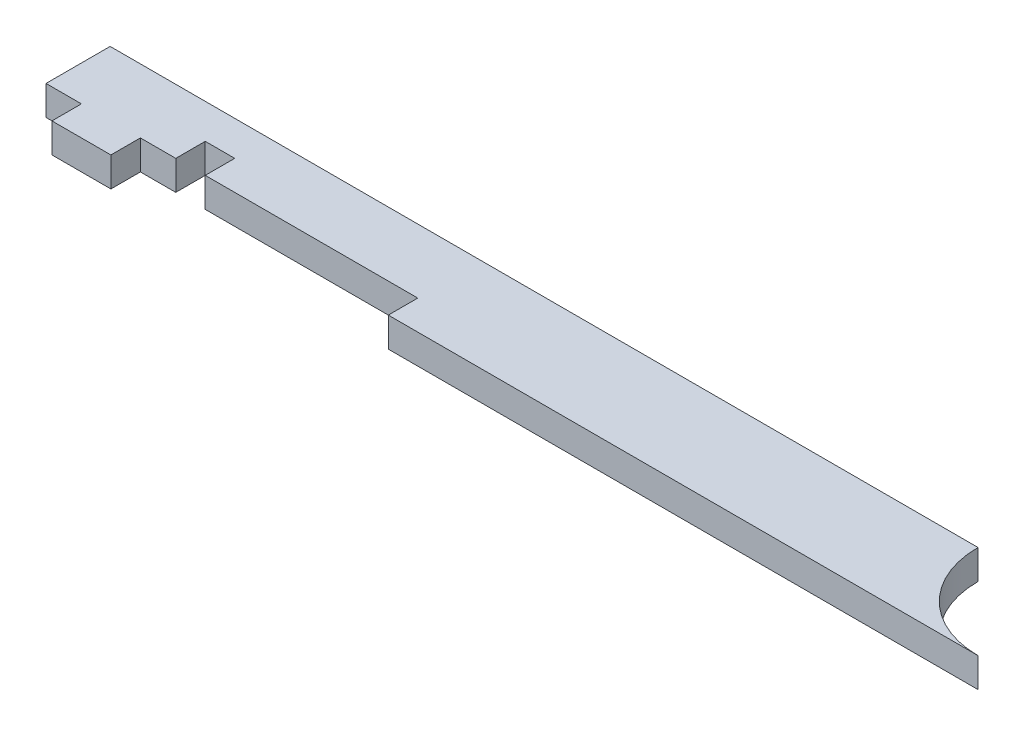
ISO-10303-21;
HEADER;
FILE_DESCRIPTION(('STEP AP214'),'2;1');
FILE_NAME('part.step','',(''),(''),'','','');
FILE_SCHEMA(('AUTOMOTIVE_DESIGN { 1 0 10303 214 1 1 1 1 }'));
ENDSEC;
DATA;
#1=APPLICATION_CONTEXT('core data for automotive mechanical design processes');
#2=APPLICATION_PROTOCOL_DEFINITION('international standard','automotive_design',2000,#1);
#3=PRODUCT_CONTEXT('',#1,'mechanical');
#4=PRODUCT('Part','Part','',(#3));
#5=PRODUCT_RELATED_PRODUCT_CATEGORY('part','',(#4));
#6=PRODUCT_DEFINITION_FORMATION('','',#4);
#7=PRODUCT_DEFINITION_CONTEXT('part definition',#1,'design');
#8=PRODUCT_DEFINITION('design','',#6,#7);
#9=PRODUCT_DEFINITION_SHAPE('','',#8);
#10=(LENGTH_UNIT() NAMED_UNIT(*) SI_UNIT(.MILLI.,.METRE.));
#11=(NAMED_UNIT(*) PLANE_ANGLE_UNIT() SI_UNIT($,.RADIAN.));
#12=(NAMED_UNIT(*) SI_UNIT($,.STERADIAN.) SOLID_ANGLE_UNIT());
#13=UNCERTAINTY_MEASURE_WITH_UNIT(LENGTH_MEASURE(1.E-05),#10,'distance_accuracy_value','');
#14=(GEOMETRIC_REPRESENTATION_CONTEXT(3) GLOBAL_UNCERTAINTY_ASSIGNED_CONTEXT((#13)) GLOBAL_UNIT_ASSIGNED_CONTEXT((#10,
#11,#12)) REPRESENTATION_CONTEXT('',''));
#15=CARTESIAN_POINT('',(0.,0.,0.));
#16=DIRECTION('',(0.,0.,1.));
#17=DIRECTION('',(1.,0.,0.));
#18=AXIS2_PLACEMENT_3D('',#15,#16,#17);
#19=CARTESIAN_POINT('',(0.,2.5,0.));
#20=DIRECTION('',(0.,-1.,0.));
#21=DIRECTION('',(0.,0.,-1.));
#22=AXIS2_PLACEMENT_3D('',#19,#20,#21);
#23=CYLINDRICAL_SURFACE('',#22,15.875);
#24=CARTESIAN_POINT('',(0.,-2.5,0.));
#25=DIRECTION('',(0.,1.,0.));
#26=DIRECTION('',(0.,0.,1.));
#27=AXIS2_PLACEMENT_3D('',#24,#25,#26);
#28=CIRCLE('',#27,15.875);
#29=CARTESIAN_POINT('',(-15.875,-2.5,0.));
#30=VERTEX_POINT('',#29);
#31=CARTESIAN_POINT('',(0.,-2.5,15.875));
#32=VERTEX_POINT('',#31);
#33=EDGE_CURVE('E173',#30,#32,#28,.T.);
#34=ORIENTED_EDGE('',*,*,#33,.F.);
#35=DIRECTION('',(0.,-1.,0.));
#36=VECTOR('',#35,1.);
#37=CARTESIAN_POINT('',(-15.875,2.5,0.));
#38=LINE('',#37,#36);
#39=CARTESIAN_POINT('',(-15.875,2.5,0.));
#40=VERTEX_POINT('',#39);
#41=EDGE_CURVE('E11',#40,#30,#38,.T.);
#42=ORIENTED_EDGE('',*,*,#41,.F.);
#43=CARTESIAN_POINT('',(0.,2.5,0.));
#44=DIRECTION('',(0.,1.,0.));
#45=DIRECTION('',(0.,0.,1.));
#46=AXIS2_PLACEMENT_3D('',#43,#44,#45);
#47=CIRCLE('',#46,15.875);
#48=CARTESIAN_POINT('',(0.,2.5,15.875));
#49=VERTEX_POINT('',#48);
#50=EDGE_CURVE('E206',#40,#49,#47,.T.);
#51=ORIENTED_EDGE('',*,*,#50,.T.);
#52=DIRECTION('',(0.,-1.,0.));
#53=VECTOR('',#52,1.);
#54=CARTESIAN_POINT('',(0.,2.5,15.875));
#55=LINE('',#54,#53);
#56=EDGE_CURVE('E57',#49,#32,#55,.T.);
#57=ORIENTED_EDGE('',*,*,#56,.T.);
#58=EDGE_LOOP('',(#34,#42,#51,#57));
#59=FACE_BOUND('',#58,.T.);
#60=ADVANCED_FACE('F41',(#59),#23,.F.);
#61=CARTESIAN_POINT('',(0.,2.5,0.));
#62=DIRECTION('',(0.,0.,1.));
#63=DIRECTION('',(1.,0.,0.));
#64=AXIS2_PLACEMENT_3D('',#61,#62,#63);
#65=PLANE('',#64);
#66=DIRECTION('',(-1.,0.,0.));
#67=VECTOR('',#66,1.);
#68=CARTESIAN_POINT('',(0.,-2.5,0.));
#69=LINE('',#68,#67);
#70=CARTESIAN_POINT('',(-163.044989152832,-2.5,0.));
#71=VERTEX_POINT('',#70);
#72=EDGE_CURVE('E175',#30,#71,#69,.T.);
#73=ORIENTED_EDGE('',*,*,#72,.T.);
#74=DIRECTION('',(0.,-1.,0.));
#75=VECTOR('',#74,1.);
#76=CARTESIAN_POINT('',(-163.044989152832,2.5,0.));
#77=LINE('',#76,#75);
#78=CARTESIAN_POINT('',(-163.044989152832,2.5,0.));
#79=VERTEX_POINT('',#78);
#80=EDGE_CURVE('E49',#79,#71,#77,.T.);
#81=ORIENTED_EDGE('',*,*,#80,.F.);
#82=DIRECTION('',(-1.,0.,0.));
#83=VECTOR('',#82,1.);
#84=CARTESIAN_POINT('',(0.,2.5,0.));
#85=LINE('',#84,#83);
#86=EDGE_CURVE('E246',#40,#79,#85,.T.);
#87=ORIENTED_EDGE('',*,*,#86,.F.);
#88=ORIENTED_EDGE('',*,*,#41,.T.);
#89=EDGE_LOOP('',(#73,#81,#87,#88));
#90=FACE_BOUND('',#89,.T.);
#91=ADVANCED_FACE('F236',(#90),#65,.F.);
#92=CARTESIAN_POINT('',(-163.044989152832,2.5,0.));
#93=DIRECTION('',(-1.,0.,0.));
#94=DIRECTION('',(0.,0.,1.));
#95=AXIS2_PLACEMENT_3D('',#92,#93,#94);
#96=PLANE('',#95);
#97=DIRECTION('',(0.,0.,-1.));
#98=VECTOR('',#97,1.);
#99=CARTESIAN_POINT('',(-163.044989152832,-2.5,0.));
#100=LINE('',#99,#98);
#101=CARTESIAN_POINT('',(-163.044989152832,-2.5,10.875));
#102=VERTEX_POINT('',#101);
#103=EDGE_CURVE('E178',#102,#71,#100,.T.);
#104=ORIENTED_EDGE('',*,*,#103,.F.);
#105=DIRECTION('',(0.,-1.,0.));
#106=VECTOR('',#105,1.);
#107=CARTESIAN_POINT('',(-163.044989152832,2.5,10.875));
#108=LINE('',#107,#106);
#109=CARTESIAN_POINT('',(-163.044989152832,2.5,10.875));
#110=VERTEX_POINT('',#109);
#111=EDGE_CURVE('E226',#110,#102,#108,.T.);
#112=ORIENTED_EDGE('',*,*,#111,.F.);
#113=DIRECTION('',(0.,0.,-1.));
#114=VECTOR('',#113,1.);
#115=CARTESIAN_POINT('',(-163.044989152832,2.5,0.));
#116=LINE('',#115,#114);
#117=EDGE_CURVE('E233',#110,#79,#116,.T.);
#118=ORIENTED_EDGE('',*,*,#117,.T.);
#119=ORIENTED_EDGE('',*,*,#80,.T.);
#120=EDGE_LOOP('',(#104,#112,#118,#119));
#121=FACE_BOUND('',#120,.T.);
#122=ADVANCED_FACE('F231',(#121),#96,.T.);
#123=CARTESIAN_POINT('',(0.,2.5,10.875));
#124=DIRECTION('',(0.,0.,1.));
#125=DIRECTION('',(1.,0.,0.));
#126=AXIS2_PLACEMENT_3D('',#123,#124,#125);
#127=PLANE('',#126);
#128=DIRECTION('',(-1.,0.,0.));
#129=VECTOR('',#128,1.);
#130=CARTESIAN_POINT('',(0.,-2.5,10.875));
#131=LINE('',#130,#129);
#132=CARTESIAN_POINT('',(-157.04,-2.5,10.875));
#133=VERTEX_POINT('',#132);
#134=EDGE_CURVE('E181',#133,#102,#131,.T.);
#135=ORIENTED_EDGE('',*,*,#134,.F.);
#136=DIRECTION('',(0.,-1.,0.));
#137=VECTOR('',#136,1.);
#138=CARTESIAN_POINT('',(-157.04,2.5,10.875));
#139=LINE('',#138,#137);
#140=CARTESIAN_POINT('',(-157.04,2.5,10.875));
#141=VERTEX_POINT('',#140);
#142=EDGE_CURVE('E224',#141,#133,#139,.T.);
#143=ORIENTED_EDGE('',*,*,#142,.F.);
#144=DIRECTION('',(-1.,0.,0.));
#145=VECTOR('',#144,1.);
#146=CARTESIAN_POINT('',(0.,2.5,10.875));
#147=LINE('',#146,#145);
#148=EDGE_CURVE('E165',#141,#110,#147,.T.);
#149=ORIENTED_EDGE('',*,*,#148,.T.);
#150=ORIENTED_EDGE('',*,*,#111,.T.);
#151=EDGE_LOOP('',(#135,#143,#149,#150));
#152=FACE_BOUND('',#151,.T.);
#153=ADVANCED_FACE('F242',(#152),#127,.T.);
#154=CARTESIAN_POINT('',(-157.04,2.5,0.));
#155=DIRECTION('',(1.,0.,0.));
#156=DIRECTION('',(0.,0.,-1.));
#157=AXIS2_PLACEMENT_3D('',#154,#155,#156);
#158=PLANE('',#157);
#159=DIRECTION('',(0.,0.,1.));
#160=VECTOR('',#159,1.);
#161=CARTESIAN_POINT('',(-157.04,-2.5,0.));
#162=LINE('',#161,#160);
#163=CARTESIAN_POINT('',(-157.04,-2.5,15.875));
#164=VERTEX_POINT('',#163);
#165=EDGE_CURVE('E184',#133,#164,#162,.T.);
#166=ORIENTED_EDGE('',*,*,#165,.T.);
#167=DIRECTION('',(0.,-1.,0.));
#168=VECTOR('',#167,1.);
#169=CARTESIAN_POINT('',(-157.04,2.5,15.875));
#170=LINE('',#169,#168);
#171=CARTESIAN_POINT('',(-157.04,2.5,15.875));
#172=VERTEX_POINT('',#171);
#173=EDGE_CURVE('E222',#172,#164,#170,.T.);
#174=ORIENTED_EDGE('',*,*,#173,.F.);
#175=DIRECTION('',(0.,0.,1.));
#176=VECTOR('',#175,1.);
#177=CARTESIAN_POINT('',(-157.04,2.5,0.));
#178=LINE('',#177,#176);
#179=EDGE_CURVE('E248',#141,#172,#178,.T.);
#180=ORIENTED_EDGE('',*,*,#179,.F.);
#181=ORIENTED_EDGE('',*,*,#142,.T.);
#182=EDGE_LOOP('',(#166,#174,#180,#181));
#183=FACE_BOUND('',#182,.T.);
#184=ADVANCED_FACE('F288',(#183),#158,.F.);
#185=CARTESIAN_POINT('',(0.,2.5,15.875));
#186=DIRECTION('',(0.,0.,1.));
#187=DIRECTION('',(1.,0.,0.));
#188=AXIS2_PLACEMENT_3D('',#185,#186,#187);
#189=PLANE('',#188);
#190=DIRECTION('',(-1.,0.,0.));
#191=VECTOR('',#190,1.);
#192=CARTESIAN_POINT('',(0.,-2.5,15.875));
#193=LINE('',#192,#191);
#194=CARTESIAN_POINT('',(-147.04,-2.5,15.875));
#195=VERTEX_POINT('',#194);
#196=EDGE_CURVE('E188',#195,#164,#193,.T.);
#197=ORIENTED_EDGE('',*,*,#196,.F.);
#198=DIRECTION('',(0.,-1.,0.));
#199=VECTOR('',#198,1.);
#200=CARTESIAN_POINT('',(-147.04,2.5,15.875));
#201=LINE('',#200,#199);
#202=CARTESIAN_POINT('',(-147.04,2.5,15.875));
#203=VERTEX_POINT('',#202);
#204=EDGE_CURVE('E220',#203,#195,#201,.T.);
#205=ORIENTED_EDGE('',*,*,#204,.F.);
#206=DIRECTION('',(-1.,0.,0.));
#207=VECTOR('',#206,1.);
#208=CARTESIAN_POINT('',(0.,2.5,15.875));
#209=LINE('',#208,#207);
#210=EDGE_CURVE('E253',#203,#172,#209,.T.);
#211=ORIENTED_EDGE('',*,*,#210,.T.);
#212=ORIENTED_EDGE('',*,*,#173,.T.);
#213=EDGE_LOOP('',(#197,#205,#211,#212));
#214=FACE_BOUND('',#213,.T.);
#215=ADVANCED_FACE('F285',(#214),#189,.T.);
#216=CARTESIAN_POINT('',(-147.04,2.5,0.));
#217=DIRECTION('',(1.,0.,0.));
#218=DIRECTION('',(0.,0.,-1.));
#219=AXIS2_PLACEMENT_3D('',#216,#217,#218);
#220=PLANE('',#219);
#221=DIRECTION('',(0.,0.,1.));
#222=VECTOR('',#221,1.);
#223=CARTESIAN_POINT('',(-147.04,-2.5,0.));
#224=LINE('',#223,#222);
#225=CARTESIAN_POINT('',(-147.04,-2.5,10.875));
#226=VERTEX_POINT('',#225);
#227=EDGE_CURVE('E191',#226,#195,#224,.T.);
#228=ORIENTED_EDGE('',*,*,#227,.F.);
#229=DIRECTION('',(0.,-1.,0.));
#230=VECTOR('',#229,1.);
#231=CARTESIAN_POINT('',(-147.04,2.5,10.875));
#232=LINE('',#231,#230);
#233=CARTESIAN_POINT('',(-147.04,2.5,10.875));
#234=VERTEX_POINT('',#233);
#235=EDGE_CURVE('E218',#234,#226,#232,.T.);
#236=ORIENTED_EDGE('',*,*,#235,.F.);
#237=DIRECTION('',(0.,0.,1.));
#238=VECTOR('',#237,1.);
#239=CARTESIAN_POINT('',(-147.04,2.5,0.));
#240=LINE('',#239,#238);
#241=EDGE_CURVE('E256',#234,#203,#240,.T.);
#242=ORIENTED_EDGE('',*,*,#241,.T.);
#243=ORIENTED_EDGE('',*,*,#204,.T.);
#244=EDGE_LOOP('',(#228,#236,#242,#243));
#245=FACE_BOUND('',#244,.T.);
#246=ADVANCED_FACE('F281',(#245),#220,.T.);
#247=CARTESIAN_POINT('',(-141.04,-2.5,10.875));
#248=VERTEX_POINT('',#247);
#249=EDGE_CURVE('E185',#248,#226,#131,.T.);
#250=ORIENTED_EDGE('',*,*,#249,.F.);
#251=DIRECTION('',(0.,-1.,0.));
#252=VECTOR('',#251,1.);
#253=CARTESIAN_POINT('',(-141.04,2.5,10.875));
#254=LINE('',#253,#252);
#255=CARTESIAN_POINT('',(-141.04,2.5,10.875));
#256=VERTEX_POINT('',#255);
#257=EDGE_CURVE('E216',#256,#248,#254,.T.);
#258=ORIENTED_EDGE('',*,*,#257,.F.);
#259=EDGE_CURVE('E164',#256,#234,#147,.T.);
#260=ORIENTED_EDGE('',*,*,#259,.T.);
#261=ORIENTED_EDGE('',*,*,#235,.T.);
#262=EDGE_LOOP('',(#250,#258,#260,#261));
#263=FACE_BOUND('',#262,.T.);
#264=ADVANCED_FACE('F277',(#263),#127,.T.);
#265=CARTESIAN_POINT('',(-141.04,2.5,0.));
#266=DIRECTION('',(-1.,0.,0.));
#267=DIRECTION('',(0.,0.,1.));
#268=AXIS2_PLACEMENT_3D('',#265,#266,#267);
#269=PLANE('',#268);
#270=DIRECTION('',(0.,0.,-1.));
#271=VECTOR('',#270,1.);
#272=CARTESIAN_POINT('',(-141.04,-2.5,0.));
#273=LINE('',#272,#271);
#274=CARTESIAN_POINT('',(-141.04,-2.5,5.875));
#275=VERTEX_POINT('',#274);
#276=EDGE_CURVE('E194',#248,#275,#273,.T.);
#277=ORIENTED_EDGE('',*,*,#276,.T.);
#278=DIRECTION('',(0.,-1.,0.));
#279=VECTOR('',#278,1.);
#280=CARTESIAN_POINT('',(-141.04,2.5,5.875));
#281=LINE('',#280,#279);
#282=CARTESIAN_POINT('',(-141.04,2.5,5.875));
#283=VERTEX_POINT('',#282);
#284=EDGE_CURVE('E213',#283,#275,#281,.T.);
#285=ORIENTED_EDGE('',*,*,#284,.F.);
#286=DIRECTION('',(0.,0.,-1.));
#287=VECTOR('',#286,1.);
#288=CARTESIAN_POINT('',(-141.04,2.5,0.));
#289=LINE('',#288,#287);
#290=EDGE_CURVE('E259',#256,#283,#289,.T.);
#291=ORIENTED_EDGE('',*,*,#290,.F.);
#292=ORIENTED_EDGE('',*,*,#257,.T.);
#293=EDGE_LOOP('',(#277,#285,#291,#292));
#294=FACE_BOUND('',#293,.T.);
#295=ADVANCED_FACE('F318',(#294),#269,.F.);
#296=CARTESIAN_POINT('',(0.,2.5,5.87499999999998));
#297=DIRECTION('',(0.,0.,-1.));
#298=DIRECTION('',(-1.,0.,0.));
#299=AXIS2_PLACEMENT_3D('',#296,#297,#298);
#300=PLANE('',#299);
#301=DIRECTION('',(1.,0.,0.));
#302=VECTOR('',#301,1.);
#303=CARTESIAN_POINT('',(0.,-2.5,5.87499999999998));
#304=LINE('',#303,#302);
#305=CARTESIAN_POINT('',(-136.04,-2.5,5.875));
#306=VERTEX_POINT('',#305);
#307=EDGE_CURVE('E196',#275,#306,#304,.T.);
#308=ORIENTED_EDGE('',*,*,#307,.T.);
#309=DIRECTION('',(0.,-1.,0.));
#310=VECTOR('',#309,1.);
#311=CARTESIAN_POINT('',(-136.04,2.5,5.875));
#312=LINE('',#311,#310);
#313=CARTESIAN_POINT('',(-136.04,2.5,5.875));
#314=VERTEX_POINT('',#313);
#315=EDGE_CURVE('E210',#314,#306,#312,.T.);
#316=ORIENTED_EDGE('',*,*,#315,.F.);
#317=DIRECTION('',(1.,0.,0.));
#318=VECTOR('',#317,1.);
#319=CARTESIAN_POINT('',(0.,2.5,5.87499999999998));
#320=LINE('',#319,#318);
#321=EDGE_CURVE('E260',#283,#314,#320,.T.);
#322=ORIENTED_EDGE('',*,*,#321,.F.);
#323=ORIENTED_EDGE('',*,*,#284,.T.);
#324=EDGE_LOOP('',(#308,#316,#322,#323));
#325=FACE_BOUND('',#324,.T.);
#326=ADVANCED_FACE('F267',(#325),#300,.F.);
#327=CARTESIAN_POINT('',(-136.04,2.5,0.));
#328=DIRECTION('',(1.,0.,0.));
#329=DIRECTION('',(0.,0.,-1.));
#330=AXIS2_PLACEMENT_3D('',#327,#328,#329);
#331=PLANE('',#330);
#332=DIRECTION('',(0.,0.,1.));
#333=VECTOR('',#332,1.);
#334=CARTESIAN_POINT('',(-136.04,-2.5,0.));
#335=LINE('',#334,#333);
#336=CARTESIAN_POINT('',(-136.04,-2.5,10.875));
#337=VERTEX_POINT('',#336);
#338=EDGE_CURVE('E198',#306,#337,#335,.T.);
#339=ORIENTED_EDGE('',*,*,#338,.T.);
#340=DIRECTION('',(0.,-1.,0.));
#341=VECTOR('',#340,1.);
#342=CARTESIAN_POINT('',(-136.04,2.5,10.875));
#343=LINE('',#342,#341);
#344=CARTESIAN_POINT('',(-136.04,2.5,10.875));
#345=VERTEX_POINT('',#344);
#346=EDGE_CURVE('E152',#345,#337,#343,.T.);
#347=ORIENTED_EDGE('',*,*,#346,.F.);
#348=DIRECTION('',(0.,0.,1.));
#349=VECTOR('',#348,1.);
#350=CARTESIAN_POINT('',(-136.04,2.5,0.));
#351=LINE('',#350,#349);
#352=EDGE_CURVE('E161',#314,#345,#351,.T.);
#353=ORIENTED_EDGE('',*,*,#352,.F.);
#354=ORIENTED_EDGE('',*,*,#315,.T.);
#355=EDGE_LOOP('',(#339,#347,#353,#354));
#356=FACE_BOUND('',#355,.T.);
#357=ADVANCED_FACE('F271',(#356),#331,.F.);
#358=CARTESIAN_POINT('',(-100.,-2.5,10.875));
#359=VERTEX_POINT('',#358);
#360=EDGE_CURVE('E148',#359,#337,#131,.T.);
#361=ORIENTED_EDGE('',*,*,#360,.F.);
#362=DIRECTION('',(0.,-1.,0.));
#363=VECTOR('',#362,1.);
#364=CARTESIAN_POINT('',(-100.,2.5,10.875));
#365=LINE('',#364,#363);
#366=CARTESIAN_POINT('',(-100.,2.5,10.875));
#367=VERTEX_POINT('',#366);
#368=EDGE_CURVE('E143',#367,#359,#365,.T.);
#369=ORIENTED_EDGE('',*,*,#368,.F.);
#370=EDGE_CURVE('E146',#367,#345,#147,.T.);
#371=ORIENTED_EDGE('',*,*,#370,.T.);
#372=ORIENTED_EDGE('',*,*,#346,.T.);
#373=EDGE_LOOP('',(#361,#369,#371,#372));
#374=FACE_BOUND('',#373,.T.);
#375=ADVANCED_FACE('F145',(#374),#127,.T.);
#376=CARTESIAN_POINT('',(-100.,2.5,0.));
#377=DIRECTION('',(-1.,0.,0.));
#378=DIRECTION('',(0.,0.,1.));
#379=AXIS2_PLACEMENT_3D('',#376,#377,#378);
#380=PLANE('',#379);
#381=DIRECTION('',(0.,0.,-1.));
#382=VECTOR('',#381,1.);
#383=CARTESIAN_POINT('',(-100.,-2.5,0.));
#384=LINE('',#383,#382);
#385=CARTESIAN_POINT('',(-100.,-2.5,15.875));
#386=VERTEX_POINT('',#385);
#387=EDGE_CURVE('E201',#386,#359,#384,.T.);
#388=ORIENTED_EDGE('',*,*,#387,.F.);
#389=DIRECTION('',(0.,-1.,0.));
#390=VECTOR('',#389,1.);
#391=CARTESIAN_POINT('',(-100.,2.5,15.875));
#392=LINE('',#391,#390);
#393=CARTESIAN_POINT('',(-100.,2.5,15.875));
#394=VERTEX_POINT('',#393);
#395=EDGE_CURVE('E100',#394,#386,#392,.T.);
#396=ORIENTED_EDGE('',*,*,#395,.F.);
#397=DIRECTION('',(0.,0.,-1.));
#398=VECTOR('',#397,1.);
#399=CARTESIAN_POINT('',(-100.,2.5,0.));
#400=LINE('',#399,#398);
#401=EDGE_CURVE('E159',#394,#367,#400,.T.);
#402=ORIENTED_EDGE('',*,*,#401,.T.);
#403=ORIENTED_EDGE('',*,*,#368,.T.);
#404=EDGE_LOOP('',(#388,#396,#402,#403));
#405=FACE_BOUND('',#404,.T.);
#406=ADVANCED_FACE('F166',(#405),#380,.T.);
#407=CARTESIAN_POINT('',(0.,2.5,15.875));
#408=DIRECTION('',(0.,0.,1.));
#409=DIRECTION('',(1.,0.,0.));
#410=AXIS2_PLACEMENT_3D('',#407,#408,#409);
#411=PLANE('',#410);
#412=DIRECTION('',(-1.,0.,0.));
#413=VECTOR('',#412,1.);
#414=CARTESIAN_POINT('',(0.,-2.5,15.875));
#415=LINE('',#414,#413);
#416=EDGE_CURVE('E203',#32,#386,#415,.T.);
#417=ORIENTED_EDGE('',*,*,#416,.F.);
#418=ORIENTED_EDGE('',*,*,#56,.F.);
#419=DIRECTION('',(-1.,0.,0.));
#420=VECTOR('',#419,1.);
#421=CARTESIAN_POINT('',(0.,2.5,15.875));
#422=LINE('',#421,#420);
#423=EDGE_CURVE('E167',#49,#394,#422,.T.);
#424=ORIENTED_EDGE('',*,*,#423,.T.);
#425=ORIENTED_EDGE('',*,*,#395,.T.);
#426=EDGE_LOOP('',(#417,#418,#424,#425));
#427=FACE_BOUND('',#426,.T.);
#428=ADVANCED_FACE('F302',(#427),#411,.T.);
#429=CARTESIAN_POINT('',(0.,2.5,0.));
#430=DIRECTION('',(0.,1.,0.));
#431=DIRECTION('',(0.,0.,1.));
#432=AXIS2_PLACEMENT_3D('',#429,#430,#431);
#433=PLANE('',#432);
#434=ORIENTED_EDGE('',*,*,#50,.F.);
#435=ORIENTED_EDGE('',*,*,#86,.T.);
#436=ORIENTED_EDGE('',*,*,#117,.F.);
#437=ORIENTED_EDGE('',*,*,#148,.F.);
#438=ORIENTED_EDGE('',*,*,#179,.T.);
#439=ORIENTED_EDGE('',*,*,#210,.F.);
#440=ORIENTED_EDGE('',*,*,#241,.F.);
#441=ORIENTED_EDGE('',*,*,#259,.F.);
#442=ORIENTED_EDGE('',*,*,#290,.T.);
#443=ORIENTED_EDGE('',*,*,#321,.T.);
#444=ORIENTED_EDGE('',*,*,#352,.T.);
#445=ORIENTED_EDGE('',*,*,#370,.F.);
#446=ORIENTED_EDGE('',*,*,#401,.F.);
#447=ORIENTED_EDGE('',*,*,#423,.F.);
#448=EDGE_LOOP('',(#434,#435,#436,#437,#438,#439,#440,#441,#442,#443,#444,#445,#446,#447));
#449=FACE_BOUND('',#448,.T.);
#450=ADVANCED_FACE('F157',(#449),#433,.T.);
#451=CARTESIAN_POINT('',(0.,-2.5,0.));
#452=DIRECTION('',(0.,1.,0.));
#453=DIRECTION('',(0.,0.,1.));
#454=AXIS2_PLACEMENT_3D('',#451,#452,#453);
#455=PLANE('',#454);
#456=ORIENTED_EDGE('',*,*,#33,.T.);
#457=ORIENTED_EDGE('',*,*,#416,.T.);
#458=ORIENTED_EDGE('',*,*,#387,.T.);
#459=ORIENTED_EDGE('',*,*,#360,.T.);
#460=ORIENTED_EDGE('',*,*,#338,.F.);
#461=ORIENTED_EDGE('',*,*,#307,.F.);
#462=ORIENTED_EDGE('',*,*,#276,.F.);
#463=ORIENTED_EDGE('',*,*,#249,.T.);
#464=ORIENTED_EDGE('',*,*,#227,.T.);
#465=ORIENTED_EDGE('',*,*,#196,.T.);
#466=ORIENTED_EDGE('',*,*,#165,.F.);
#467=ORIENTED_EDGE('',*,*,#134,.T.);
#468=ORIENTED_EDGE('',*,*,#103,.T.);
#469=ORIENTED_EDGE('',*,*,#72,.F.);
#470=EDGE_LOOP('',(#456,#457,#458,#459,#460,#461,#462,#463,#464,#465,#466,#467,#468,#469));
#471=FACE_BOUND('',#470,.T.);
#472=ADVANCED_FACE('F238',(#471),#455,.F.);
#473=CLOSED_SHELL('',(#60,#91,#122,#153,#184,#215,#246,#264,#295,#326,#357,#375,#406,#428,#450,#472));
#474=MANIFOLD_SOLID_BREP('B2',#473);
#475=ADVANCED_BREP_SHAPE_REPRESENTATION('',(#18,#474),#14);
#476=SHAPE_DEFINITION_REPRESENTATION(#9,#475);
ENDSEC;
END-ISO-10303-21;
